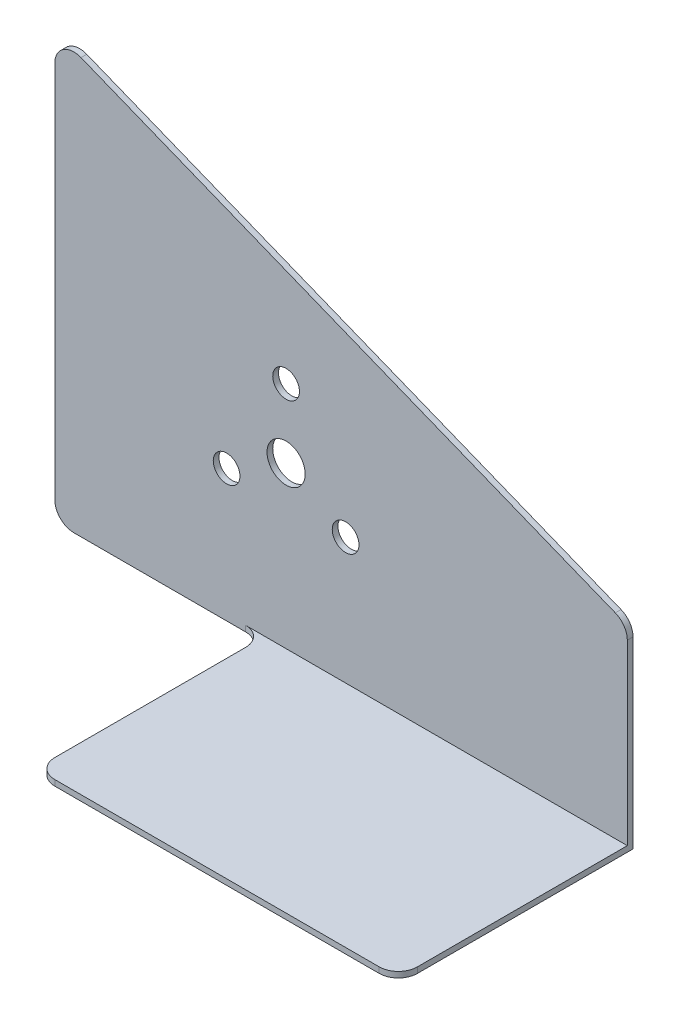
ISO-10303-21;
HEADER;
FILE_DESCRIPTION(('STEP AP214'),'2;1');
FILE_NAME('part.step','',(''),(''),'','','');
FILE_SCHEMA(('AUTOMOTIVE_DESIGN { 1 0 10303 214 1 1 1 1 }'));
ENDSEC;
DATA;
#1=APPLICATION_CONTEXT('core data for automotive mechanical design processes');
#2=APPLICATION_PROTOCOL_DEFINITION('international standard','automotive_design',2000,#1);
#3=PRODUCT_CONTEXT('',#1,'mechanical');
#4=PRODUCT('Part','Part','',(#3));
#5=PRODUCT_RELATED_PRODUCT_CATEGORY('part','',(#4));
#6=PRODUCT_DEFINITION_FORMATION('','',#4);
#7=PRODUCT_DEFINITION_CONTEXT('part definition',#1,'design');
#8=PRODUCT_DEFINITION('design','',#6,#7);
#9=PRODUCT_DEFINITION_SHAPE('','',#8);
#10=(LENGTH_UNIT() NAMED_UNIT(*) SI_UNIT(.MILLI.,.METRE.));
#11=(NAMED_UNIT(*) PLANE_ANGLE_UNIT() SI_UNIT($,.RADIAN.));
#12=(NAMED_UNIT(*) SI_UNIT($,.STERADIAN.) SOLID_ANGLE_UNIT());
#13=UNCERTAINTY_MEASURE_WITH_UNIT(LENGTH_MEASURE(1.E-05),#10,'distance_accuracy_value','');
#14=(GEOMETRIC_REPRESENTATION_CONTEXT(3) GLOBAL_UNCERTAINTY_ASSIGNED_CONTEXT((#13)) GLOBAL_UNIT_ASSIGNED_CONTEXT((#10,
#11,#12)) REPRESENTATION_CONTEXT('',''));
#15=CARTESIAN_POINT('',(0.,0.,0.));
#16=DIRECTION('',(0.,0.,1.));
#17=DIRECTION('',(1.,0.,0.));
#18=AXIS2_PLACEMENT_3D('',#15,#16,#17);
#19=CARTESIAN_POINT('',(0.,-3.,120.));
#20=DIRECTION('',(0.,1.,0.));
#21=DIRECTION('',(0.,0.,1.));
#22=AXIS2_PLACEMENT_3D('',#19,#20,#21);
#23=PLANE('',#22);
#24=DIRECTION('',(-1.,0.,0.));
#25=VECTOR('',#24,1.);
#26=CARTESIAN_POINT('',(190.,-3.,0.));
#27=LINE('',#26,#25);
#28=CARTESIAN_POINT('',(-10.,-3.,0.));
#29=VERTEX_POINT('',#28);
#30=CARTESIAN_POINT('',(-100.,-3.,0.));
#31=VERTEX_POINT('',#30);
#32=EDGE_CURVE('E165',#29,#31,#27,.T.);
#33=ORIENTED_EDGE('',*,*,#32,.T.);
#34=DIRECTION('',(0.,0.,1.));
#35=VECTOR('',#34,1.);
#36=CARTESIAN_POINT('',(-100.,-3.,120.));
#37=LINE('',#36,#35);
#38=CARTESIAN_POINT('',(-100.,-3.,-3.));
#39=VERTEX_POINT('',#38);
#40=EDGE_CURVE('E155',#31,#39,#37,.F.);
#41=ORIENTED_EDGE('',*,*,#40,.T.);
#42=DIRECTION('',(-1.,0.,0.));
#43=VECTOR('',#42,1.);
#44=CARTESIAN_POINT('',(190.,-3.,-3.));
#45=LINE('',#44,#43);
#46=CARTESIAN_POINT('',(190.,-3.,-3.));
#47=VERTEX_POINT('',#46);
#48=EDGE_CURVE('E132',#47,#39,#45,.T.);
#49=ORIENTED_EDGE('',*,*,#48,.F.);
#50=DIRECTION('',(0.,0.,-1.));
#51=VECTOR('',#50,1.);
#52=CARTESIAN_POINT('',(190.,-3.,120.));
#53=LINE('',#52,#51);
#54=CARTESIAN_POINT('',(190.,-3.,110.));
#55=VERTEX_POINT('',#54);
#56=EDGE_CURVE('E144',#55,#47,#53,.T.);
#57=ORIENTED_EDGE('',*,*,#56,.F.);
#58=CARTESIAN_POINT('',(180.,-3.,110.));
#59=DIRECTION('',(0.,1.,0.));
#60=DIRECTION('',(0.,0.,1.));
#61=AXIS2_PLACEMENT_3D('',#58,#59,#60);
#62=CIRCLE('',#61,10.);
#63=CARTESIAN_POINT('',(180.,-3.,120.));
#64=VERTEX_POINT('',#63);
#65=EDGE_CURVE('E205',#55,#64,#62,.F.);
#66=ORIENTED_EDGE('',*,*,#65,.T.);
#67=DIRECTION('',(1.,0.,0.));
#68=VECTOR('',#67,1.);
#69=CARTESIAN_POINT('',(0.,-3.,120.));
#70=LINE('',#69,#68);
#71=CARTESIAN_POINT('',(10.,-3.,120.));
#72=VERTEX_POINT('',#71);
#73=EDGE_CURVE('E176',#72,#64,#70,.T.);
#74=ORIENTED_EDGE('',*,*,#73,.F.);
#75=CARTESIAN_POINT('',(10.,-3.,110.));
#76=DIRECTION('',(0.,1.,0.));
#77=DIRECTION('',(0.,0.,1.));
#78=AXIS2_PLACEMENT_3D('',#75,#76,#77);
#79=CIRCLE('',#78,10.);
#80=CARTESIAN_POINT('',(0.,-3.,110.));
#81=VERTEX_POINT('',#80);
#82=EDGE_CURVE('E203',#72,#81,#79,.F.);
#83=ORIENTED_EDGE('',*,*,#82,.T.);
#84=DIRECTION('',(0.,0.,-1.));
#85=VECTOR('',#84,1.);
#86=CARTESIAN_POINT('',(0.,-3.,120.));
#87=LINE('',#86,#85);
#88=CARTESIAN_POINT('',(0.,-3.,9.99999999999999));
#89=VERTEX_POINT('',#88);
#90=EDGE_CURVE('E182',#81,#89,#87,.T.);
#91=ORIENTED_EDGE('',*,*,#90,.T.);
#92=CARTESIAN_POINT('',(-10.,-3.,10.));
#93=DIRECTION('',(0.,1.,0.));
#94=DIRECTION('',(0.,0.,1.));
#95=AXIS2_PLACEMENT_3D('',#92,#93,#94);
#96=CIRCLE('',#95,10.);
#97=EDGE_CURVE('E11',#89,#29,#96,.T.);
#98=ORIENTED_EDGE('',*,*,#97,.T.);
#99=EDGE_LOOP('',(#33,#41,#49,#57,#66,#74,#83,#91,#98));
#100=FACE_BOUND('',#99,.T.);
#101=ADVANCED_FACE('F33',(#100),#23,.F.);
#102=CARTESIAN_POINT('',(190.,0.,120.));
#103=DIRECTION('',(1.,0.,0.));
#104=DIRECTION('',(0.,0.,-1.));
#105=AXIS2_PLACEMENT_3D('',#102,#103,#104);
#106=PLANE('',#105);
#107=DIRECTION('',(0.,-1.,0.));
#108=VECTOR('',#107,1.);
#109=CARTESIAN_POINT('',(190.,0.,-3.));
#110=LINE('',#109,#108);
#111=CARTESIAN_POINT('',(190.,93.229670385731,-3.));
#112=VERTEX_POINT('',#111);
#113=EDGE_CURVE('E128',#112,#47,#110,.T.);
#114=ORIENTED_EDGE('',*,*,#113,.F.);
#115=DIRECTION('',(0.,0.,1.));
#116=VECTOR('',#115,1.);
#117=CARTESIAN_POINT('',(190.,93.229670385731,0.));
#118=LINE('',#117,#116);
#119=CARTESIAN_POINT('',(190.,93.229670385731,0.));
#120=VERTEX_POINT('',#119);
#121=EDGE_CURVE('E219',#112,#120,#118,.T.);
#122=ORIENTED_EDGE('',*,*,#121,.T.);
#123=DIRECTION('',(0.,-1.,0.));
#124=VECTOR('',#123,1.);
#125=CARTESIAN_POINT('',(190.,0.,0.));
#126=LINE('',#125,#124);
#127=CARTESIAN_POINT('',(190.,0.,0.));
#128=VERTEX_POINT('',#127);
#129=EDGE_CURVE('E140',#120,#128,#126,.T.);
#130=ORIENTED_EDGE('',*,*,#129,.T.);
#131=DIRECTION('',(0.,0.,-1.));
#132=VECTOR('',#131,1.);
#133=CARTESIAN_POINT('',(190.,0.,120.));
#134=LINE('',#133,#132);
#135=CARTESIAN_POINT('',(190.,0.,110.));
#136=VERTEX_POINT('',#135);
#137=EDGE_CURVE('E151',#136,#128,#134,.T.);
#138=ORIENTED_EDGE('',*,*,#137,.F.);
#139=DIRECTION('',(0.,-1.,0.));
#140=VECTOR('',#139,1.);
#141=CARTESIAN_POINT('',(190.,-3.,110.));
#142=LINE('',#141,#140);
#143=EDGE_CURVE('E148',#136,#55,#142,.T.);
#144=ORIENTED_EDGE('',*,*,#143,.T.);
#145=ORIENTED_EDGE('',*,*,#56,.T.);
#146=EDGE_LOOP('',(#114,#122,#130,#138,#144,#145));
#147=FACE_BOUND('',#146,.T.);
#148=ADVANCED_FACE('F145',(#147),#106,.T.);
#149=CARTESIAN_POINT('',(0.,0.,120.));
#150=DIRECTION('',(0.,1.,0.));
#151=DIRECTION('',(0.,0.,1.));
#152=AXIS2_PLACEMENT_3D('',#149,#150,#151);
#153=PLANE('',#152);
#154=DIRECTION('',(1.,0.,0.));
#155=VECTOR('',#154,1.);
#156=CARTESIAN_POINT('',(0.,0.,120.));
#157=LINE('',#156,#155);
#158=CARTESIAN_POINT('',(10.,0.,120.));
#159=VERTEX_POINT('',#158);
#160=CARTESIAN_POINT('',(180.,0.,120.));
#161=VERTEX_POINT('',#160);
#162=EDGE_CURVE('E179',#159,#161,#157,.T.);
#163=ORIENTED_EDGE('',*,*,#162,.T.);
#164=CARTESIAN_POINT('',(180.,0.,110.));
#165=DIRECTION('',(0.,1.,0.));
#166=DIRECTION('',(0.,0.,1.));
#167=AXIS2_PLACEMENT_3D('',#164,#165,#166);
#168=CIRCLE('',#167,10.);
#169=EDGE_CURVE('E226',#161,#136,#168,.T.);
#170=ORIENTED_EDGE('',*,*,#169,.T.);
#171=ORIENTED_EDGE('',*,*,#137,.T.);
#172=DIRECTION('',(1.,0.,0.));
#173=VECTOR('',#172,1.);
#174=CARTESIAN_POINT('',(0.,0.,0.));
#175=LINE('',#174,#173);
#176=CARTESIAN_POINT('',(-10.,0.,0.));
#177=VERTEX_POINT('',#176);
#178=EDGE_CURVE('E164',#177,#128,#175,.T.);
#179=ORIENTED_EDGE('',*,*,#178,.F.);
#180=CARTESIAN_POINT('',(-10.,0.,10.));
#181=DIRECTION('',(0.,1.,0.));
#182=DIRECTION('',(0.,0.,1.));
#183=AXIS2_PLACEMENT_3D('',#180,#181,#182);
#184=CIRCLE('',#183,10.);
#185=CARTESIAN_POINT('',(0.,0.,9.99999999999999));
#186=VERTEX_POINT('',#185);
#187=EDGE_CURVE('E41',#177,#186,#184,.F.);
#188=ORIENTED_EDGE('',*,*,#187,.T.);
#189=DIRECTION('',(0.,0.,-1.));
#190=VECTOR('',#189,1.);
#191=CARTESIAN_POINT('',(0.,0.,120.));
#192=LINE('',#191,#190);
#193=CARTESIAN_POINT('',(0.,0.,110.));
#194=VERTEX_POINT('',#193);
#195=EDGE_CURVE('E187',#194,#186,#192,.T.);
#196=ORIENTED_EDGE('',*,*,#195,.F.);
#197=CARTESIAN_POINT('',(10.,0.,110.));
#198=DIRECTION('',(0.,1.,0.));
#199=DIRECTION('',(0.,0.,1.));
#200=AXIS2_PLACEMENT_3D('',#197,#198,#199);
#201=CIRCLE('',#200,10.);
#202=EDGE_CURVE('E55',#194,#159,#201,.T.);
#203=ORIENTED_EDGE('',*,*,#202,.T.);
#204=EDGE_LOOP('',(#163,#170,#171,#179,#188,#196,#203));
#205=FACE_BOUND('',#204,.T.);
#206=ADVANCED_FACE('F236',(#205),#153,.T.);
#207=CARTESIAN_POINT('',(0.,-3.,120.));
#208=DIRECTION('',(-1.,0.,0.));
#209=DIRECTION('',(0.,0.,1.));
#210=AXIS2_PLACEMENT_3D('',#207,#208,#209);
#211=PLANE('',#210);
#212=ORIENTED_EDGE('',*,*,#90,.F.);
#213=DIRECTION('',(0.,1.,0.));
#214=VECTOR('',#213,1.);
#215=CARTESIAN_POINT('',(0.,0.,110.));
#216=LINE('',#215,#214);
#217=EDGE_CURVE('E230',#81,#194,#216,.T.);
#218=ORIENTED_EDGE('',*,*,#217,.T.);
#219=ORIENTED_EDGE('',*,*,#195,.T.);
#220=DIRECTION('',(0.,1.,0.));
#221=VECTOR('',#220,1.);
#222=CARTESIAN_POINT('',(0.,-3.,9.99999999999999));
#223=LINE('',#222,#221);
#224=EDGE_CURVE('E228',#186,#89,#223,.F.);
#225=ORIENTED_EDGE('',*,*,#224,.T.);
#226=EDGE_LOOP('',(#212,#218,#219,#225));
#227=FACE_BOUND('',#226,.T.);
#228=ADVANCED_FACE('F233',(#227),#211,.T.);
#229=CARTESIAN_POINT('',(0.,0.,120.));
#230=DIRECTION('',(0.,0.,-1.));
#231=DIRECTION('',(-1.,0.,0.));
#232=AXIS2_PLACEMENT_3D('',#229,#230,#231);
#233=PLANE('',#232);
#234=ORIENTED_EDGE('',*,*,#73,.T.);
#235=DIRECTION('',(0.,-1.,0.));
#236=VECTOR('',#235,1.);
#237=CARTESIAN_POINT('',(180.,0.,120.));
#238=LINE('',#237,#236);
#239=EDGE_CURVE('E223',#64,#161,#238,.F.);
#240=ORIENTED_EDGE('',*,*,#239,.T.);
#241=ORIENTED_EDGE('',*,*,#162,.F.);
#242=DIRECTION('',(0.,1.,0.));
#243=VECTOR('',#242,1.);
#244=CARTESIAN_POINT('',(10.,-3.,120.));
#245=LINE('',#244,#243);
#246=EDGE_CURVE('E221',#159,#72,#245,.F.);
#247=ORIENTED_EDGE('',*,*,#246,.T.);
#248=EDGE_LOOP('',(#234,#240,#241,#247));
#249=FACE_BOUND('',#248,.T.);
#250=ADVANCED_FACE('F240',(#249),#233,.F.);
#251=CARTESIAN_POINT('',(0.,0.,0.));
#252=DIRECTION('',(0.,0.,-1.));
#253=DIRECTION('',(-1.,0.,0.));
#254=AXIS2_PLACEMENT_3D('',#251,#252,#253);
#255=PLANE('',#254);
#256=CARTESIAN_POINT('',(-19.9816415216543,66.1999999999998,0.));
#257=DIRECTION('',(0.,0.,-1.));
#258=DIRECTION('',(-1.,0.,0.));
#259=AXIS2_PLACEMENT_3D('',#256,#257,#258);
#260=CIRCLE('',#259,6.9999999999999);
#261=CARTESIAN_POINT('',(-26.9816415216542,66.1999999999998,0.));
#262=VERTEX_POINT('',#261);
#263=EDGE_CURVE('E422',#262,#262,#260,.T.);
#264=ORIENTED_EDGE('',*,*,#263,.T.);
#265=EDGE_LOOP('',(#264));
#266=FACE_BOUND('',#265,.T.);
#267=CARTESIAN_POINT('',(11.1952730145854,120.2,0.));
#268=DIRECTION('',(0.,0.,-1.));
#269=DIRECTION('',(-1.,0.,0.));
#270=AXIS2_PLACEMENT_3D('',#267,#268,#269);
#271=CIRCLE('',#270,7.);
#272=CARTESIAN_POINT('',(4.19527301458545,120.2,0.));
#273=VERTEX_POINT('',#272);
#274=EDGE_CURVE('E425',#273,#273,#271,.T.);
#275=ORIENTED_EDGE('',*,*,#274,.T.);
#276=EDGE_LOOP('',(#275));
#277=FACE_BOUND('',#276,.T.);
#278=CARTESIAN_POINT('',(11.1952730145854,84.2,0.));
#279=DIRECTION('',(0.,0.,-1.));
#280=DIRECTION('',(-1.,0.,0.));
#281=AXIS2_PLACEMENT_3D('',#278,#279,#280);
#282=CIRCLE('',#281,10.);
#283=CARTESIAN_POINT('',(1.19527301458544,84.2,0.));
#284=VERTEX_POINT('',#283);
#285=EDGE_CURVE('E435',#284,#284,#282,.T.);
#286=ORIENTED_EDGE('',*,*,#285,.T.);
#287=EDGE_LOOP('',(#286));
#288=FACE_BOUND('',#287,.T.);
#289=CARTESIAN_POINT('',(42.3721875508252,66.1999999999998,0.));
#290=DIRECTION('',(0.,0.,-1.));
#291=DIRECTION('',(-1.,0.,0.));
#292=AXIS2_PLACEMENT_3D('',#289,#290,#291);
#293=CIRCLE('',#292,7.00000000000001);
#294=CARTESIAN_POINT('',(35.3721875508252,66.1999999999998,0.));
#295=VERTEX_POINT('',#294);
#296=EDGE_CURVE('E168',#295,#295,#293,.T.);
#297=ORIENTED_EDGE('',*,*,#296,.T.);
#298=EDGE_LOOP('',(#297));
#299=FACE_BOUND('',#298,.T.);
#300=DIRECTION('',(0.,1.,0.));
#301=VECTOR('',#300,1.);
#302=CARTESIAN_POINT('',(-110.,220.,0.));
#303=LINE('',#302,#301);
#304=CARTESIAN_POINT('',(-110.,7.00000000000001,0.));
#305=VERTEX_POINT('',#304);
#306=CARTESIAN_POINT('',(-110.,205.229670385731,0.));
#307=VERTEX_POINT('',#306);
#308=EDGE_CURVE('E167',#305,#307,#303,.T.);
#309=ORIENTED_EDGE('',*,*,#308,.F.);
#310=CARTESIAN_POINT('',(-100.,7.00000000000001,0.));
#311=DIRECTION('',(0.,0.,-1.));
#312=DIRECTION('',(-1.,0.,0.));
#313=AXIS2_PLACEMENT_3D('',#310,#311,#312);
#314=CIRCLE('',#313,10.);
#315=EDGE_CURVE('E201',#305,#31,#314,.F.);
#316=ORIENTED_EDGE('',*,*,#315,.T.);
#317=ORIENTED_EDGE('',*,*,#32,.F.);
#318=DIRECTION('',(0.,1.,0.));
#319=VECTOR('',#318,1.);
#320=CARTESIAN_POINT('',(-10.,0.,0.));
#321=LINE('',#320,#319);
#322=EDGE_CURVE('E194',#29,#177,#321,.T.);
#323=ORIENTED_EDGE('',*,*,#322,.T.);
#324=ORIENTED_EDGE('',*,*,#178,.T.);
#325=ORIENTED_EDGE('',*,*,#129,.F.);
#326=CARTESIAN_POINT('',(180.,93.229670385731,0.));
#327=DIRECTION('',(0.,0.,-1.));
#328=DIRECTION('',(-1.,0.,0.));
#329=AXIS2_PLACEMENT_3D('',#326,#327,#328);
#330=CIRCLE('',#329,10.);
#331=CARTESIAN_POINT('',(183.713906763541,102.514437294584,0.));
#332=VERTEX_POINT('',#331);
#333=EDGE_CURVE('E197',#120,#332,#330,.F.);
#334=ORIENTED_EDGE('',*,*,#333,.T.);
#335=DIRECTION('',(0.928476690885259,-0.371390676354104,0.));
#336=VECTOR('',#335,1.);
#337=CARTESIAN_POINT('',(190.,100.,0.));
#338=LINE('',#337,#336);
#339=CARTESIAN_POINT('',(-96.286093236459,214.514437294584,0.));
#340=VERTEX_POINT('',#339);
#341=EDGE_CURVE('E171',#340,#332,#338,.T.);
#342=ORIENTED_EDGE('',*,*,#341,.F.);
#343=CARTESIAN_POINT('',(-100.,205.229670385731,0.));
#344=DIRECTION('',(0.,0.,-1.));
#345=DIRECTION('',(-1.,0.,0.));
#346=AXIS2_PLACEMENT_3D('',#343,#344,#345);
#347=CIRCLE('',#346,10.);
#348=EDGE_CURVE('E199',#340,#307,#347,.F.);
#349=ORIENTED_EDGE('',*,*,#348,.T.);
#350=EDGE_LOOP('',(#309,#316,#317,#323,#324,#325,#334,#342,#349));
#351=FACE_BOUND('',#350,.T.);
#352=ADVANCED_FACE('F250',(#266,#277,#288,#299,#351),#255,.F.);
#353=CARTESIAN_POINT('',(-110.,220.,-3.));
#354=DIRECTION('',(1.,0.,0.));
#355=DIRECTION('',(0.,1.,0.));
#356=AXIS2_PLACEMENT_3D('',#353,#354,#355);
#357=PLANE('',#356);
#358=DIRECTION('',(0.,1.,0.));
#359=VECTOR('',#358,1.);
#360=CARTESIAN_POINT('',(-110.,-3.,-3.));
#361=LINE('',#360,#359);
#362=CARTESIAN_POINT('',(-110.,7.,-3.));
#363=VERTEX_POINT('',#362);
#364=CARTESIAN_POINT('',(-110.,205.229670385731,-3.));
#365=VERTEX_POINT('',#364);
#366=EDGE_CURVE('E156',#363,#365,#361,.T.);
#367=ORIENTED_EDGE('',*,*,#366,.F.);
#368=DIRECTION('',(0.,0.,1.));
#369=VECTOR('',#368,1.);
#370=CARTESIAN_POINT('',(-110.,7.00000000000001,-3.));
#371=LINE('',#370,#369);
#372=EDGE_CURVE('E191',#363,#305,#371,.T.);
#373=ORIENTED_EDGE('',*,*,#372,.T.);
#374=ORIENTED_EDGE('',*,*,#308,.T.);
#375=DIRECTION('',(0.,0.,1.));
#376=VECTOR('',#375,1.);
#377=CARTESIAN_POINT('',(-110.,205.229670385731,-3.));
#378=LINE('',#377,#376);
#379=EDGE_CURVE('E150',#307,#365,#378,.F.);
#380=ORIENTED_EDGE('',*,*,#379,.T.);
#381=EDGE_LOOP('',(#367,#373,#374,#380));
#382=FACE_BOUND('',#381,.T.);
#383=ADVANCED_FACE('F259',(#382),#357,.F.);
#384=CARTESIAN_POINT('',(190.,100.,-3.));
#385=DIRECTION('',(-0.371390676354104,-0.928476690885259,0.));
#386=DIRECTION('',(0.928476690885259,-0.371390676354104,0.));
#387=AXIS2_PLACEMENT_3D('',#384,#385,#386);
#388=PLANE('',#387);
#389=DIRECTION('',(0.928476690885259,-0.371390676354104,0.));
#390=VECTOR('',#389,1.);
#391=CARTESIAN_POINT('',(190.,100.,-3.));
#392=LINE('',#391,#390);
#393=CARTESIAN_POINT('',(-96.286093236459,214.514437294584,-3.));
#394=VERTEX_POINT('',#393);
#395=CARTESIAN_POINT('',(183.713906763541,102.514437294584,-3.));
#396=VERTEX_POINT('',#395);
#397=EDGE_CURVE('E159',#394,#396,#392,.T.);
#398=ORIENTED_EDGE('',*,*,#397,.F.);
#399=DIRECTION('',(0.,0.,1.));
#400=VECTOR('',#399,1.);
#401=CARTESIAN_POINT('',(-96.286093236459,214.514437294584,-3.));
#402=LINE('',#401,#400);
#403=EDGE_CURVE('E215',#394,#340,#402,.T.);
#404=ORIENTED_EDGE('',*,*,#403,.T.);
#405=ORIENTED_EDGE('',*,*,#341,.T.);
#406=DIRECTION('',(0.,0.,1.));
#407=VECTOR('',#406,1.);
#408=CARTESIAN_POINT('',(183.713906763541,102.514437294584,-3.));
#409=LINE('',#408,#407);
#410=EDGE_CURVE('E213',#332,#396,#409,.F.);
#411=ORIENTED_EDGE('',*,*,#410,.T.);
#412=EDGE_LOOP('',(#398,#404,#405,#411));
#413=FACE_BOUND('',#412,.T.);
#414=ADVANCED_FACE('F268',(#413),#388,.F.);
#415=CARTESIAN_POINT('',(0.,0.,-3.));
#416=DIRECTION('',(0.,0.,-1.));
#417=DIRECTION('',(-1.,0.,0.));
#418=AXIS2_PLACEMENT_3D('',#415,#416,#417);
#419=PLANE('',#418);
#420=CARTESIAN_POINT('',(-19.9816415216543,66.1999999999998,-3.));
#421=DIRECTION('',(0.,0.,-1.));
#422=DIRECTION('',(-1.,0.,0.));
#423=AXIS2_PLACEMENT_3D('',#420,#421,#422);
#424=CIRCLE('',#423,6.9999999999999);
#425=CARTESIAN_POINT('',(-26.9816415216542,66.1999999999998,-3.));
#426=VERTEX_POINT('',#425);
#427=EDGE_CURVE('E424',#426,#426,#424,.T.);
#428=ORIENTED_EDGE('',*,*,#427,.F.);
#429=EDGE_LOOP('',(#428));
#430=FACE_BOUND('',#429,.T.);
#431=CARTESIAN_POINT('',(11.1952730145854,120.2,-3.));
#432=DIRECTION('',(0.,0.,-1.));
#433=DIRECTION('',(-1.,0.,0.));
#434=AXIS2_PLACEMENT_3D('',#431,#432,#433);
#435=CIRCLE('',#434,7.);
#436=CARTESIAN_POINT('',(4.19527301458545,120.2,-3.));
#437=VERTEX_POINT('',#436);
#438=EDGE_CURVE('E430',#437,#437,#435,.T.);
#439=ORIENTED_EDGE('',*,*,#438,.F.);
#440=EDGE_LOOP('',(#439));
#441=FACE_BOUND('',#440,.T.);
#442=CARTESIAN_POINT('',(11.1952730145854,84.2,-3.));
#443=DIRECTION('',(0.,0.,-1.));
#444=DIRECTION('',(-1.,0.,0.));
#445=AXIS2_PLACEMENT_3D('',#442,#443,#444);
#446=CIRCLE('',#445,10.);
#447=CARTESIAN_POINT('',(1.19527301458544,84.2,-3.));
#448=VERTEX_POINT('',#447);
#449=EDGE_CURVE('E438',#448,#448,#446,.T.);
#450=ORIENTED_EDGE('',*,*,#449,.F.);
#451=EDGE_LOOP('',(#450));
#452=FACE_BOUND('',#451,.T.);
#453=CARTESIAN_POINT('',(42.3721875508252,66.1999999999998,-3.));
#454=DIRECTION('',(0.,0.,-1.));
#455=DIRECTION('',(-1.,0.,0.));
#456=AXIS2_PLACEMENT_3D('',#453,#454,#455);
#457=CIRCLE('',#456,7.00000000000001);
#458=CARTESIAN_POINT('',(35.3721875508252,66.1999999999998,-3.));
#459=VERTEX_POINT('',#458);
#460=EDGE_CURVE('E427',#459,#459,#457,.T.);
#461=ORIENTED_EDGE('',*,*,#460,.F.);
#462=EDGE_LOOP('',(#461));
#463=FACE_BOUND('',#462,.T.);
#464=ORIENTED_EDGE('',*,*,#48,.T.);
#465=CARTESIAN_POINT('',(-100.,7.00000000000001,-3.));
#466=DIRECTION('',(0.,0.,-1.));
#467=DIRECTION('',(-1.,0.,0.));
#468=AXIS2_PLACEMENT_3D('',#465,#466,#467);
#469=CIRCLE('',#468,10.);
#470=EDGE_CURVE('E211',#39,#363,#469,.T.);
#471=ORIENTED_EDGE('',*,*,#470,.T.);
#472=ORIENTED_EDGE('',*,*,#366,.T.);
#473=CARTESIAN_POINT('',(-100.,205.229670385731,-3.));
#474=DIRECTION('',(0.,0.,-1.));
#475=DIRECTION('',(-1.,0.,0.));
#476=AXIS2_PLACEMENT_3D('',#473,#474,#475);
#477=CIRCLE('',#476,10.);
#478=EDGE_CURVE('E209',#365,#394,#477,.T.);
#479=ORIENTED_EDGE('',*,*,#478,.T.);
#480=ORIENTED_EDGE('',*,*,#397,.T.);
#481=CARTESIAN_POINT('',(180.,93.229670385731,-3.));
#482=DIRECTION('',(0.,0.,-1.));
#483=DIRECTION('',(-1.,0.,0.));
#484=AXIS2_PLACEMENT_3D('',#481,#482,#483);
#485=CIRCLE('',#484,10.);
#486=EDGE_CURVE('E136',#396,#112,#485,.T.);
#487=ORIENTED_EDGE('',*,*,#486,.T.);
#488=ORIENTED_EDGE('',*,*,#113,.T.);
#489=EDGE_LOOP('',(#464,#471,#472,#479,#480,#487,#488));
#490=FACE_BOUND('',#489,.T.);
#491=ADVANCED_FACE('F130',(#430,#441,#452,#463,#490),#419,.T.);
#492=CARTESIAN_POINT('',(-100.,7.00000000000001,-3.));
#493=DIRECTION('',(0.,0.,1.));
#494=DIRECTION('',(1.,0.,0.));
#495=AXIS2_PLACEMENT_3D('',#492,#493,#494);
#496=CYLINDRICAL_SURFACE('',#495,10.);
#497=ORIENTED_EDGE('',*,*,#470,.F.);
#498=ORIENTED_EDGE('',*,*,#40,.F.);
#499=ORIENTED_EDGE('',*,*,#315,.F.);
#500=ORIENTED_EDGE('',*,*,#372,.F.);
#501=EDGE_LOOP('',(#497,#498,#499,#500));
#502=FACE_BOUND('',#501,.T.);
#503=ADVANCED_FACE('F256',(#502),#496,.T.);
#504=CARTESIAN_POINT('',(-100.,205.229670385731,-3.));
#505=DIRECTION('',(0.,0.,1.));
#506=DIRECTION('',(1.,0.,0.));
#507=AXIS2_PLACEMENT_3D('',#504,#505,#506);
#508=CYLINDRICAL_SURFACE('',#507,10.);
#509=ORIENTED_EDGE('',*,*,#478,.F.);
#510=ORIENTED_EDGE('',*,*,#379,.F.);
#511=ORIENTED_EDGE('',*,*,#348,.F.);
#512=ORIENTED_EDGE('',*,*,#403,.F.);
#513=EDGE_LOOP('',(#509,#510,#511,#512));
#514=FACE_BOUND('',#513,.T.);
#515=ADVANCED_FACE('F265',(#514),#508,.T.);
#516=CARTESIAN_POINT('',(180.,93.229670385731,120.));
#517=DIRECTION('',(0.,0.,-1.));
#518=DIRECTION('',(-1.,0.,0.));
#519=AXIS2_PLACEMENT_3D('',#516,#517,#518);
#520=CYLINDRICAL_SURFACE('',#519,10.);
#521=ORIENTED_EDGE('',*,*,#486,.F.);
#522=ORIENTED_EDGE('',*,*,#410,.F.);
#523=ORIENTED_EDGE('',*,*,#333,.F.);
#524=ORIENTED_EDGE('',*,*,#121,.F.);
#525=EDGE_LOOP('',(#521,#522,#523,#524));
#526=FACE_BOUND('',#525,.T.);
#527=ADVANCED_FACE('F271',(#526),#520,.T.);
#528=CARTESIAN_POINT('',(180.,0.,110.));
#529=DIRECTION('',(0.,1.,0.));
#530=DIRECTION('',(0.,0.,1.));
#531=AXIS2_PLACEMENT_3D('',#528,#529,#530);
#532=CYLINDRICAL_SURFACE('',#531,10.);
#533=ORIENTED_EDGE('',*,*,#169,.F.);
#534=ORIENTED_EDGE('',*,*,#239,.F.);
#535=ORIENTED_EDGE('',*,*,#65,.F.);
#536=ORIENTED_EDGE('',*,*,#143,.F.);
#537=EDGE_LOOP('',(#533,#534,#535,#536));
#538=FACE_BOUND('',#537,.T.);
#539=ADVANCED_FACE('F246',(#538),#532,.T.);
#540=CARTESIAN_POINT('',(10.,-3.,110.));
#541=DIRECTION('',(0.,-1.,0.));
#542=DIRECTION('',(0.,0.,-1.));
#543=AXIS2_PLACEMENT_3D('',#540,#541,#542);
#544=CYLINDRICAL_SURFACE('',#543,10.);
#545=ORIENTED_EDGE('',*,*,#82,.F.);
#546=ORIENTED_EDGE('',*,*,#246,.F.);
#547=ORIENTED_EDGE('',*,*,#202,.F.);
#548=ORIENTED_EDGE('',*,*,#217,.F.);
#549=EDGE_LOOP('',(#545,#546,#547,#548));
#550=FACE_BOUND('',#549,.T.);
#551=ADVANCED_FACE('F243',(#550),#544,.T.);
#552=CARTESIAN_POINT('',(-10.,0.,10.));
#553=DIRECTION('',(0.,1.,0.));
#554=DIRECTION('',(0.,0.,1.));
#555=AXIS2_PLACEMENT_3D('',#552,#553,#554);
#556=CYLINDRICAL_SURFACE('',#555,10.);
#557=ORIENTED_EDGE('',*,*,#97,.F.);
#558=ORIENTED_EDGE('',*,*,#224,.F.);
#559=ORIENTED_EDGE('',*,*,#187,.F.);
#560=ORIENTED_EDGE('',*,*,#322,.F.);
#561=EDGE_LOOP('',(#557,#558,#559,#560));
#562=FACE_BOUND('',#561,.T.);
#563=ADVANCED_FACE('F35',(#562),#556,.F.);
#564=CARTESIAN_POINT('',(42.3721875508252,66.1999999999998,0.));
#565=DIRECTION('',(0.,0.,-1.));
#566=DIRECTION('',(-1.,0.,0.));
#567=AXIS2_PLACEMENT_3D('',#564,#565,#566);
#568=CYLINDRICAL_SURFACE('',#567,7.00000000000001);
#569=ORIENTED_EDGE('',*,*,#296,.F.);
#570=EDGE_LOOP('',(#569));
#571=FACE_BOUND('',#570,.T.);
#572=ORIENTED_EDGE('',*,*,#460,.T.);
#573=EDGE_LOOP('',(#572));
#574=FACE_BOUND('',#573,.T.);
#575=ADVANCED_FACE('F304',(#571,#574),#568,.F.);
#576=CARTESIAN_POINT('',(11.1952730145854,84.2,0.));
#577=DIRECTION('',(0.,0.,-1.));
#578=DIRECTION('',(-1.,0.,0.));
#579=AXIS2_PLACEMENT_3D('',#576,#577,#578);
#580=CYLINDRICAL_SURFACE('',#579,10.);
#581=ORIENTED_EDGE('',*,*,#285,.F.);
#582=EDGE_LOOP('',(#581));
#583=FACE_BOUND('',#582,.T.);
#584=ORIENTED_EDGE('',*,*,#449,.T.);
#585=EDGE_LOOP('',(#584));
#586=FACE_BOUND('',#585,.T.);
#587=ADVANCED_FACE('F385',(#583,#586),#580,.F.);
#588=CARTESIAN_POINT('',(11.1952730145854,120.2,0.));
#589=DIRECTION('',(0.,0.,-1.));
#590=DIRECTION('',(-1.,0.,0.));
#591=AXIS2_PLACEMENT_3D('',#588,#589,#590);
#592=CYLINDRICAL_SURFACE('',#591,7.);
#593=ORIENTED_EDGE('',*,*,#274,.F.);
#594=EDGE_LOOP('',(#593));
#595=FACE_BOUND('',#594,.T.);
#596=ORIENTED_EDGE('',*,*,#438,.T.);
#597=EDGE_LOOP('',(#596));
#598=FACE_BOUND('',#597,.T.);
#599=ADVANCED_FACE('F393',(#595,#598),#592,.F.);
#600=CARTESIAN_POINT('',(-19.9816415216543,66.1999999999998,0.));
#601=DIRECTION('',(0.,0.,-1.));
#602=DIRECTION('',(-1.,0.,0.));
#603=AXIS2_PLACEMENT_3D('',#600,#601,#602);
#604=CYLINDRICAL_SURFACE('',#603,6.9999999999999);
#605=ORIENTED_EDGE('',*,*,#263,.F.);
#606=EDGE_LOOP('',(#605));
#607=FACE_BOUND('',#606,.T.);
#608=ORIENTED_EDGE('',*,*,#427,.T.);
#609=EDGE_LOOP('',(#608));
#610=FACE_BOUND('',#609,.T.);
#611=ADVANCED_FACE('F401',(#607,#610),#604,.F.);
#612=CLOSED_SHELL('',(#101,#148,#206,#228,#250,#352,#383,#414,#491,#503,#515,#527,#539,#551,
#563,#575,#587,#599,#611));
#613=MANIFOLD_SOLID_BREP('B2',#612);
#614=ADVANCED_BREP_SHAPE_REPRESENTATION('',(#18,#613),#14);
#615=SHAPE_DEFINITION_REPRESENTATION(#9,#614);
ENDSEC;
END-ISO-10303-21;
